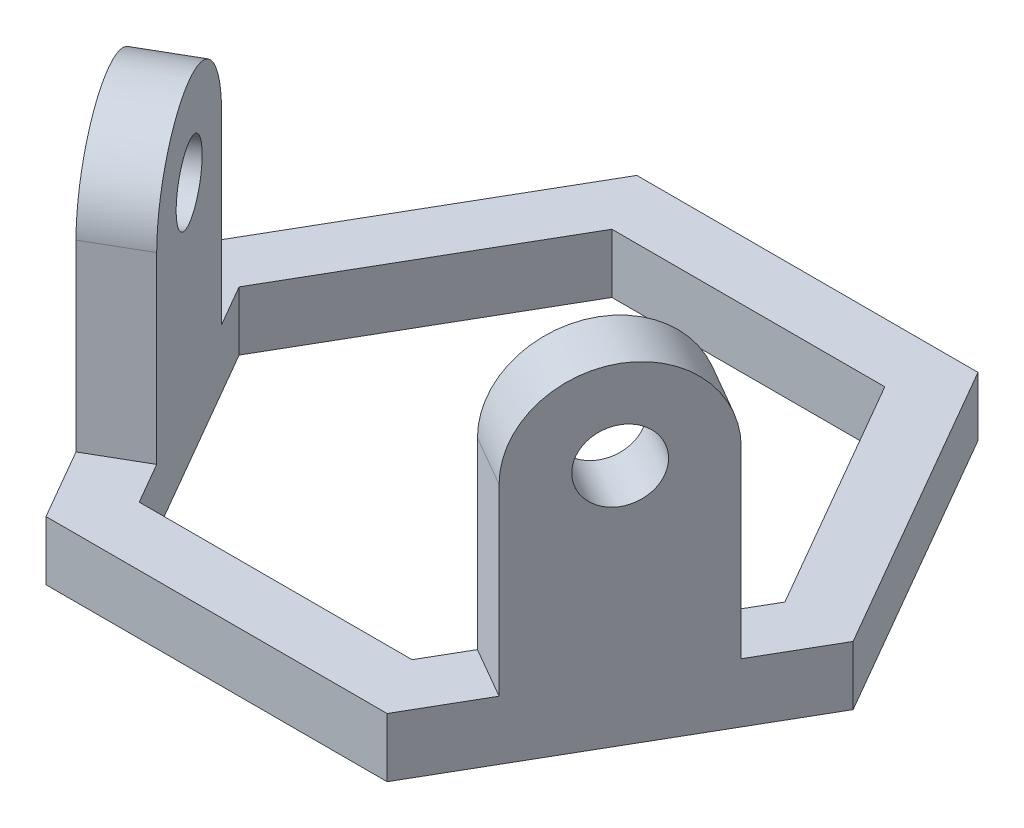
ISO-10303-21;
HEADER;
FILE_DESCRIPTION(('STEP AP214'),'2;1');
FILE_NAME('part.step','',(''),(''),'','','');
FILE_SCHEMA(('AUTOMOTIVE_DESIGN { 1 0 10303 214 1 1 1 1 }'));
ENDSEC;
DATA;
#1=APPLICATION_CONTEXT('core data for automotive mechanical design processes');
#2=APPLICATION_PROTOCOL_DEFINITION('international standard','automotive_design',2000,#1);
#3=PRODUCT_CONTEXT('',#1,'mechanical');
#4=PRODUCT('Part','Part','',(#3));
#5=PRODUCT_RELATED_PRODUCT_CATEGORY('part','',(#4));
#6=PRODUCT_DEFINITION_FORMATION('','',#4);
#7=PRODUCT_DEFINITION_CONTEXT('part definition',#1,'design');
#8=PRODUCT_DEFINITION('design','',#6,#7);
#9=PRODUCT_DEFINITION_SHAPE('','',#8);
#10=(LENGTH_UNIT() NAMED_UNIT(*) SI_UNIT(.MILLI.,.METRE.));
#11=(NAMED_UNIT(*) PLANE_ANGLE_UNIT() SI_UNIT($,.RADIAN.));
#12=(NAMED_UNIT(*) SI_UNIT($,.STERADIAN.) SOLID_ANGLE_UNIT());
#13=UNCERTAINTY_MEASURE_WITH_UNIT(LENGTH_MEASURE(1.E-05),#10,'distance_accuracy_value','');
#14=(GEOMETRIC_REPRESENTATION_CONTEXT(3) GLOBAL_UNCERTAINTY_ASSIGNED_CONTEXT((#13)) GLOBAL_UNIT_ASSIGNED_CONTEXT((#10,
#11,#12)) REPRESENTATION_CONTEXT('',''));
#15=CARTESIAN_POINT('',(0.,0.,0.));
#16=DIRECTION('',(0.,0.,1.));
#17=DIRECTION('',(1.,0.,0.));
#18=AXIS2_PLACEMENT_3D('',#15,#16,#17);
#19=CARTESIAN_POINT('',(0.,10.,0.));
#20=DIRECTION('',(0.,1.,0.));
#21=DIRECTION('',(0.,0.,1.));
#22=AXIS2_PLACEMENT_3D('',#19,#20,#21);
#23=PLANE('',#22);
#24=DIRECTION('',(0.5,0.,-0.866025403784438));
#25=VECTOR('',#24,1.);
#26=CARTESIAN_POINT('',(23.0940107675853,10.,40.0000000000003));
#27=LINE('',#26,#25);
#28=CARTESIAN_POINT('',(42.1410161513778,9.99999999999999,7.00961894323331));
#29=VERTEX_POINT('',#28);
#30=CARTESIAN_POINT('',(46.1880215351703,10.,3.32199545649559E-13));
#31=VERTEX_POINT('',#30);
#32=EDGE_CURVE('E246',#29,#31,#27,.T.);
#33=ORIENTED_EDGE('',*,*,#32,.F.);
#34=DIRECTION('',(0.866025403784442,0.,0.499999999999995));
#35=VECTOR('',#34,1.);
#36=CARTESIAN_POINT('',(42.1410161513778,9.99999999999999,7.00961894323331));
#37=LINE('',#36,#35);
#38=CARTESIAN_POINT('',(50.8012701892222,10.,12.0096189432333));
#39=VERTEX_POINT('',#38);
#40=EDGE_CURVE('E216',#29,#39,#37,.T.);
#41=ORIENTED_EDGE('',*,*,#40,.T.);
#42=DIRECTION('',(0.499999999999995,0.,-0.866025403784441));
#43=VECTOR('',#42,1.);
#44=CARTESIAN_POINT('',(28.8675134594819,10.,49.9999999999997));
#45=LINE('',#44,#43);
#46=CARTESIAN_POINT('',(57.7350269189626,10.,0.));
#47=VERTEX_POINT('',#46);
#48=EDGE_CURVE('E299',#39,#47,#45,.T.);
#49=ORIENTED_EDGE('',*,*,#48,.T.);
#50=DIRECTION('',(-0.500000000000001,0.,-0.866025403784438));
#51=VECTOR('',#50,1.);
#52=CARTESIAN_POINT('',(57.7350269189626,10.,0.));
#53=LINE('',#52,#51);
#54=CARTESIAN_POINT('',(28.8675134594812,10.,-50.0000000000001));
#55=VERTEX_POINT('',#54);
#56=EDGE_CURVE('E300',#47,#55,#53,.T.);
#57=ORIENTED_EDGE('',*,*,#56,.T.);
#58=DIRECTION('',(-1.,0.,0.));
#59=VECTOR('',#58,1.);
#60=CARTESIAN_POINT('',(28.8675134594812,10.,-50.0000000000001));
#61=LINE('',#60,#59);
#62=CARTESIAN_POINT('',(-28.8675134594815,10.,-49.9999999999999));
#63=VERTEX_POINT('',#62);
#64=EDGE_CURVE('E298',#55,#63,#61,.T.);
#65=ORIENTED_EDGE('',*,*,#64,.T.);
#66=DIRECTION('',(-0.499999999999995,0.,0.866025403784442));
#67=VECTOR('',#66,1.);
#68=CARTESIAN_POINT('',(-28.8675134594815,10.,-49.9999999999999));
#69=LINE('',#68,#67);
#70=CARTESIAN_POINT('',(-57.7350269189626,10.,4.03161538170328E-13));
#71=VERTEX_POINT('',#70);
#72=EDGE_CURVE('E305',#63,#71,#69,.T.);
#73=ORIENTED_EDGE('',*,*,#72,.T.);
#74=DIRECTION('',(0.500000000000007,0.,0.866025403784435));
#75=VECTOR('',#74,1.);
#76=CARTESIAN_POINT('',(-57.7350269189626,10.,4.03161538170328E-13));
#77=LINE('',#76,#75);
#78=CARTESIAN_POINT('',(-50.8012701892219,10.,12.0096189432338));
#79=VERTEX_POINT('',#78);
#80=EDGE_CURVE('E301',#71,#79,#77,.T.);
#81=ORIENTED_EDGE('',*,*,#80,.T.);
#82=DIRECTION('',(-0.866025403784435,0.,0.500000000000007));
#83=VECTOR('',#82,1.);
#84=CARTESIAN_POINT('',(-42.1410161513775,10.,7.00961894323377));
#85=LINE('',#84,#83);
#86=CARTESIAN_POINT('',(-42.1410161513775,10.,7.00961894323377));
#87=VERTEX_POINT('',#86);
#88=EDGE_CURVE('E243',#87,#79,#85,.T.);
#89=ORIENTED_EDGE('',*,*,#88,.F.);
#90=DIRECTION('',(0.5,0.,0.866025403784439));
#91=VECTOR('',#90,1.);
#92=CARTESIAN_POINT('',(-46.1880215351703,10.,0.));
#93=LINE('',#92,#91);
#94=CARTESIAN_POINT('',(-46.1880215351703,10.,0.));
#95=VERTEX_POINT('',#94);
#96=EDGE_CURVE('E260',#95,#87,#93,.T.);
#97=ORIENTED_EDGE('',*,*,#96,.F.);
#98=DIRECTION('',(-0.5,0.,0.866025403784439));
#99=VECTOR('',#98,1.);
#100=CARTESIAN_POINT('',(-23.0940107675852,10.,-40.0000000000001));
#101=LINE('',#100,#99);
#102=CARTESIAN_POINT('',(-23.0940107675852,10.,-40.0000000000001));
#103=VERTEX_POINT('',#102);
#104=EDGE_CURVE('E255',#103,#95,#101,.T.);
#105=ORIENTED_EDGE('',*,*,#104,.F.);
#106=DIRECTION('',(-1.,0.,0.));
#107=VECTOR('',#106,1.);
#108=CARTESIAN_POINT('',(23.094010767585,10.,-40.0000000000001));
#109=LINE('',#108,#107);
#110=CARTESIAN_POINT('',(23.094010767585,10.,-40.0000000000001));
#111=VERTEX_POINT('',#110);
#112=EDGE_CURVE('E252',#111,#103,#109,.T.);
#113=ORIENTED_EDGE('',*,*,#112,.F.);
#114=DIRECTION('',(-0.5,0.,-0.866025403784439));
#115=VECTOR('',#114,1.);
#116=CARTESIAN_POINT('',(46.1880215351703,10.,3.32199545649559E-13));
#117=LINE('',#116,#115);
#118=EDGE_CURVE('E249',#31,#111,#117,.T.);
#119=ORIENTED_EDGE('',*,*,#118,.F.);
#120=EDGE_LOOP('',(#33,#41,#49,#57,#65,#73,#81,#89,#97,#105,#113,#119));
#121=FACE_BOUND('',#120,.T.);
#122=ADVANCED_FACE('F39',(#121),#23,.T.);
#123=DIRECTION('',(0.866025403784442,0.,0.499999999999995));
#124=VECTOR('',#123,1.);
#125=CARTESIAN_POINT('',(27.1410161513779,9.99999999999999,32.9903810567665));
#126=LINE('',#125,#124);
#127=CARTESIAN_POINT('',(27.1410161513779,9.99999999999999,32.9903810567665));
#128=VERTEX_POINT('',#127);
#129=CARTESIAN_POINT('',(35.8012701892223,9.99999999999999,37.9903810567665));
#130=VERTEX_POINT('',#129);
#131=EDGE_CURVE('E187',#128,#130,#126,.T.);
#132=ORIENTED_EDGE('',*,*,#131,.F.);
#133=CARTESIAN_POINT('',(23.0940107675853,10.,40.0000000000003));
#134=VERTEX_POINT('',#133);
#135=EDGE_CURVE('E200',#134,#128,#27,.T.);
#136=ORIENTED_EDGE('',*,*,#135,.F.);
#137=DIRECTION('',(1.,0.,0.));
#138=VECTOR('',#137,1.);
#139=CARTESIAN_POINT('',(-23.0940107675851,10.,40.0000000000003));
#140=LINE('',#139,#138);
#141=CARTESIAN_POINT('',(-23.0940107675851,10.,40.0000000000003));
#142=VERTEX_POINT('',#141);
#143=EDGE_CURVE('E257',#142,#134,#140,.T.);
#144=ORIENTED_EDGE('',*,*,#143,.F.);
#145=CARTESIAN_POINT('',(-27.1410161513773,10.,32.9903810567668));
#146=VERTEX_POINT('',#145);
#147=EDGE_CURVE('E258',#146,#142,#93,.T.);
#148=ORIENTED_EDGE('',*,*,#147,.F.);
#149=DIRECTION('',(-0.866025403784435,0.,0.500000000000007));
#150=VECTOR('',#149,1.);
#151=CARTESIAN_POINT('',(-27.1410161513773,10.,32.9903810567668));
#152=LINE('',#151,#150);
#153=CARTESIAN_POINT('',(-35.8012701892216,10.,37.9903810567669));
#154=VERTEX_POINT('',#153);
#155=EDGE_CURVE('E244',#146,#154,#152,.T.);
#156=ORIENTED_EDGE('',*,*,#155,.T.);
#157=CARTESIAN_POINT('',(-28.8675134594808,10.,50.0000000000003));
#158=VERTEX_POINT('',#157);
#159=EDGE_CURVE('E304',#154,#158,#77,.T.);
#160=ORIENTED_EDGE('',*,*,#159,.T.);
#161=DIRECTION('',(1.,0.,0.));
#162=VECTOR('',#161,1.);
#163=CARTESIAN_POINT('',(-28.8675134594808,10.,50.0000000000003));
#164=LINE('',#163,#162);
#165=CARTESIAN_POINT('',(28.8675134594819,10.,49.9999999999997));
#166=VERTEX_POINT('',#165);
#167=EDGE_CURVE('E306',#158,#166,#164,.T.);
#168=ORIENTED_EDGE('',*,*,#167,.T.);
#169=EDGE_CURVE('E294',#166,#130,#45,.T.);
#170=ORIENTED_EDGE('',*,*,#169,.T.);
#171=EDGE_LOOP('',(#132,#136,#144,#148,#156,#160,#168,#170));
#172=FACE_BOUND('',#171,.T.);
#173=ADVANCED_FACE('F374',(#172),#23,.T.);
#174=CARTESIAN_POINT('',(0.,0.,0.));
#175=DIRECTION('',(0.,1.,0.));
#176=DIRECTION('',(0.,0.,1.));
#177=AXIS2_PLACEMENT_3D('',#174,#175,#176);
#178=PLANE('',#177);
#179=DIRECTION('',(0.499999999999995,0.,-0.866025403784441));
#180=VECTOR('',#179,1.);
#181=CARTESIAN_POINT('',(28.8675134594819,0.,49.9999999999997));
#182=LINE('',#181,#180);
#183=CARTESIAN_POINT('',(28.8675134594819,0.,49.9999999999997));
#184=VERTEX_POINT('',#183);
#185=CARTESIAN_POINT('',(57.7350269189626,0.,0.));
#186=VERTEX_POINT('',#185);
#187=EDGE_CURVE('E291',#184,#186,#182,.T.);
#188=ORIENTED_EDGE('',*,*,#187,.F.);
#189=DIRECTION('',(1.,0.,0.));
#190=VECTOR('',#189,1.);
#191=CARTESIAN_POINT('',(-28.8675134594808,0.,50.0000000000003));
#192=LINE('',#191,#190);
#193=CARTESIAN_POINT('',(-28.8675134594808,0.,50.0000000000003));
#194=VERTEX_POINT('',#193);
#195=EDGE_CURVE('E321',#194,#184,#192,.T.);
#196=ORIENTED_EDGE('',*,*,#195,.F.);
#197=DIRECTION('',(0.500000000000007,0.,0.866025403784435));
#198=VECTOR('',#197,1.);
#199=CARTESIAN_POINT('',(-57.7350269189626,0.,4.03161538170328E-13));
#200=LINE('',#199,#198);
#201=CARTESIAN_POINT('',(-57.7350269189626,0.,4.03161538170328E-13));
#202=VERTEX_POINT('',#201);
#203=EDGE_CURVE('E317',#202,#194,#200,.T.);
#204=ORIENTED_EDGE('',*,*,#203,.F.);
#205=DIRECTION('',(-0.499999999999995,0.,0.866025403784442));
#206=VECTOR('',#205,1.);
#207=CARTESIAN_POINT('',(-28.8675134594815,0.,-49.9999999999999));
#208=LINE('',#207,#206);
#209=CARTESIAN_POINT('',(-28.8675134594815,0.,-49.9999999999999));
#210=VERTEX_POINT('',#209);
#211=EDGE_CURVE('E320',#210,#202,#208,.T.);
#212=ORIENTED_EDGE('',*,*,#211,.F.);
#213=DIRECTION('',(-1.,0.,0.));
#214=VECTOR('',#213,1.);
#215=CARTESIAN_POINT('',(28.8675134594812,0.,-50.0000000000001));
#216=LINE('',#215,#214);
#217=CARTESIAN_POINT('',(28.8675134594812,0.,-50.0000000000001));
#218=VERTEX_POINT('',#217);
#219=EDGE_CURVE('E312',#218,#210,#216,.T.);
#220=ORIENTED_EDGE('',*,*,#219,.F.);
#221=DIRECTION('',(-0.500000000000001,0.,-0.866025403784438));
#222=VECTOR('',#221,1.);
#223=CARTESIAN_POINT('',(57.7350269189626,0.,0.));
#224=LINE('',#223,#222);
#225=EDGE_CURVE('E311',#186,#218,#224,.T.);
#226=ORIENTED_EDGE('',*,*,#225,.F.);
#227=EDGE_LOOP('',(#188,#196,#204,#212,#220,#226));
#228=FACE_BOUND('',#227,.T.);
#229=DIRECTION('',(0.5,0.,-0.866025403784438));
#230=VECTOR('',#229,1.);
#231=CARTESIAN_POINT('',(23.0940107675853,0.,40.0000000000003));
#232=LINE('',#231,#230);
#233=CARTESIAN_POINT('',(23.0940107675853,0.,40.0000000000003));
#234=VERTEX_POINT('',#233);
#235=CARTESIAN_POINT('',(46.1880215351703,0.,3.32199545649559E-13));
#236=VERTEX_POINT('',#235);
#237=EDGE_CURVE('E245',#234,#236,#232,.T.);
#238=ORIENTED_EDGE('',*,*,#237,.T.);
#239=DIRECTION('',(-0.5,0.,-0.866025403784439));
#240=VECTOR('',#239,1.);
#241=CARTESIAN_POINT('',(46.1880215351703,0.,3.32199545649559E-13));
#242=LINE('',#241,#240);
#243=CARTESIAN_POINT('',(23.094010767585,0.,-40.0000000000001));
#244=VERTEX_POINT('',#243);
#245=EDGE_CURVE('E264',#236,#244,#242,.T.);
#246=ORIENTED_EDGE('',*,*,#245,.T.);
#247=DIRECTION('',(-1.,0.,0.));
#248=VECTOR('',#247,1.);
#249=CARTESIAN_POINT('',(23.094010767585,0.,-40.0000000000001));
#250=LINE('',#249,#248);
#251=CARTESIAN_POINT('',(-23.0940107675852,0.,-40.0000000000001));
#252=VERTEX_POINT('',#251);
#253=EDGE_CURVE('E268',#244,#252,#250,.T.);
#254=ORIENTED_EDGE('',*,*,#253,.T.);
#255=DIRECTION('',(-0.5,0.,0.866025403784439));
#256=VECTOR('',#255,1.);
#257=CARTESIAN_POINT('',(-23.0940107675852,0.,-40.0000000000001));
#258=LINE('',#257,#256);
#259=CARTESIAN_POINT('',(-46.1880215351703,0.,0.));
#260=VERTEX_POINT('',#259);
#261=EDGE_CURVE('E271',#252,#260,#258,.T.);
#262=ORIENTED_EDGE('',*,*,#261,.T.);
#263=DIRECTION('',(0.5,0.,0.866025403784439));
#264=VECTOR('',#263,1.);
#265=CARTESIAN_POINT('',(-46.1880215351703,0.,0.));
#266=LINE('',#265,#264);
#267=CARTESIAN_POINT('',(-23.0940107675851,0.,40.0000000000003));
#268=VERTEX_POINT('',#267);
#269=EDGE_CURVE('E273',#260,#268,#266,.T.);
#270=ORIENTED_EDGE('',*,*,#269,.T.);
#271=DIRECTION('',(1.,0.,0.));
#272=VECTOR('',#271,1.);
#273=CARTESIAN_POINT('',(-23.0940107675851,0.,40.0000000000003));
#274=LINE('',#273,#272);
#275=EDGE_CURVE('E280',#268,#234,#274,.T.);
#276=ORIENTED_EDGE('',*,*,#275,.T.);
#277=EDGE_LOOP('',(#238,#246,#254,#262,#270,#276));
#278=FACE_BOUND('',#277,.T.);
#279=ADVANCED_FACE('F341',(#228,#278),#178,.F.);
#280=CARTESIAN_POINT('',(28.8675134594819,10.,49.9999999999997));
#281=DIRECTION('',(-0.866025403784441,0.,-0.499999999999995));
#282=DIRECTION('',(-0.499999999999995,0.,0.866025403784441));
#283=AXIS2_PLACEMENT_3D('',#280,#281,#282);
#284=PLANE('',#283);
#285=ORIENTED_EDGE('',*,*,#187,.T.);
#286=DIRECTION('',(0.,-1.,0.));
#287=VECTOR('',#286,1.);
#288=CARTESIAN_POINT('',(57.7350269189626,10.,0.));
#289=LINE('',#288,#287);
#290=EDGE_CURVE('E11',#47,#186,#289,.T.);
#291=ORIENTED_EDGE('',*,*,#290,.F.);
#292=ORIENTED_EDGE('',*,*,#48,.F.);
#293=DIRECTION('',(0.,1.,0.));
#294=VECTOR('',#293,1.);
#295=CARTESIAN_POINT('',(50.8012701892222,41.0478262350558,12.0096189432332));
#296=LINE('',#295,#294);
#297=CARTESIAN_POINT('',(50.8012701892222,41.0478262350558,12.0096189432332));
#298=VERTEX_POINT('',#297);
#299=EDGE_CURVE('E53',#39,#298,#296,.T.);
#300=ORIENTED_EDGE('',*,*,#299,.T.);
#301=CARTESIAN_POINT('',(43.3012701892223,41.0478262350558,24.9999999999999));
#302=DIRECTION('',(0.866025403784442,0.,0.499999999999995));
#303=DIRECTION('',(0.499999999999995,0.,-0.866025403784442));
#304=AXIS2_PLACEMENT_3D('',#301,#302,#303);
#305=CIRCLE('',#304,15.);
#306=CARTESIAN_POINT('',(35.8012701892223,41.0478262350558,37.9903810567665));
#307=VERTEX_POINT('',#306);
#308=EDGE_CURVE('E209',#298,#307,#305,.T.);
#309=ORIENTED_EDGE('',*,*,#308,.T.);
#310=DIRECTION('',(0.,-1.,0.));
#311=VECTOR('',#310,1.);
#312=CARTESIAN_POINT('',(35.8012701892223,9.99999999999999,37.9903810567665));
#313=LINE('',#312,#311);
#314=EDGE_CURVE('E182',#307,#130,#313,.T.);
#315=ORIENTED_EDGE('',*,*,#314,.T.);
#316=ORIENTED_EDGE('',*,*,#169,.F.);
#317=DIRECTION('',(0.,-1.,0.));
#318=VECTOR('',#317,1.);
#319=CARTESIAN_POINT('',(28.8675134594819,10.,49.9999999999997));
#320=LINE('',#319,#318);
#321=EDGE_CURVE('E309',#166,#184,#320,.T.);
#322=ORIENTED_EDGE('',*,*,#321,.T.);
#323=EDGE_LOOP('',(#285,#291,#292,#300,#309,#315,#316,#322));
#324=FACE_BOUND('',#323,.T.);
#325=CARTESIAN_POINT('',(43.3012701892223,41.0478262350558,24.9999999999999));
#326=DIRECTION('',(0.866025403784442,0.,0.499999999999995));
#327=DIRECTION('',(0.499999999999995,0.,-0.866025403784442));
#328=AXIS2_PLACEMENT_3D('',#325,#326,#327);
#329=CIRCLE('',#328,6.);
#330=CARTESIAN_POINT('',(46.3012701892222,41.0478262350558,19.8038475772932));
#331=VERTEX_POINT('',#330);
#332=EDGE_CURVE('E206',#331,#331,#329,.T.);
#333=ORIENTED_EDGE('',*,*,#332,.F.);
#334=EDGE_LOOP('',(#333));
#335=FACE_BOUND('',#334,.T.);
#336=ADVANCED_FACE('F41',(#324,#335),#284,.F.);
#337=CARTESIAN_POINT('',(57.7350269189626,10.,0.));
#338=DIRECTION('',(-0.866025403784438,0.,0.500000000000001));
#339=DIRECTION('',(0.500000000000001,0.,0.866025403784438));
#340=AXIS2_PLACEMENT_3D('',#337,#338,#339);
#341=PLANE('',#340);
#342=ORIENTED_EDGE('',*,*,#225,.T.);
#343=DIRECTION('',(0.,-1.,0.));
#344=VECTOR('',#343,1.);
#345=CARTESIAN_POINT('',(28.8675134594812,10.,-50.0000000000001));
#346=LINE('',#345,#344);
#347=EDGE_CURVE('E50',#55,#218,#346,.T.);
#348=ORIENTED_EDGE('',*,*,#347,.F.);
#349=ORIENTED_EDGE('',*,*,#56,.F.);
#350=ORIENTED_EDGE('',*,*,#290,.T.);
#351=EDGE_LOOP('',(#342,#348,#349,#350));
#352=FACE_BOUND('',#351,.T.);
#353=ADVANCED_FACE('F364',(#352),#341,.F.);
#354=CARTESIAN_POINT('',(28.8675134594812,10.,-50.0000000000001));
#355=DIRECTION('',(0.,0.,1.));
#356=DIRECTION('',(1.,0.,0.));
#357=AXIS2_PLACEMENT_3D('',#354,#355,#356);
#358=PLANE('',#357);
#359=ORIENTED_EDGE('',*,*,#219,.T.);
#360=DIRECTION('',(0.,-1.,0.));
#361=VECTOR('',#360,1.);
#362=CARTESIAN_POINT('',(-28.8675134594815,10.,-49.9999999999999));
#363=LINE('',#362,#361);
#364=EDGE_CURVE('E332',#63,#210,#363,.T.);
#365=ORIENTED_EDGE('',*,*,#364,.F.);
#366=ORIENTED_EDGE('',*,*,#64,.F.);
#367=ORIENTED_EDGE('',*,*,#347,.T.);
#368=EDGE_LOOP('',(#359,#365,#366,#367));
#369=FACE_BOUND('',#368,.T.);
#370=ADVANCED_FACE('F339',(#369),#358,.F.);
#371=CARTESIAN_POINT('',(-28.8675134594815,10.,-49.9999999999999));
#372=DIRECTION('',(0.866025403784442,0.,0.499999999999995));
#373=DIRECTION('',(0.499999999999995,0.,-0.866025403784442));
#374=AXIS2_PLACEMENT_3D('',#371,#372,#373);
#375=PLANE('',#374);
#376=ORIENTED_EDGE('',*,*,#211,.T.);
#377=DIRECTION('',(0.,-1.,0.));
#378=VECTOR('',#377,1.);
#379=CARTESIAN_POINT('',(-57.7350269189626,10.,4.03161538170328E-13));
#380=LINE('',#379,#378);
#381=EDGE_CURVE('E327',#71,#202,#380,.T.);
#382=ORIENTED_EDGE('',*,*,#381,.F.);
#383=ORIENTED_EDGE('',*,*,#72,.F.);
#384=ORIENTED_EDGE('',*,*,#364,.T.);
#385=EDGE_LOOP('',(#376,#382,#383,#384));
#386=FACE_BOUND('',#385,.T.);
#387=ADVANCED_FACE('F352',(#386),#375,.F.);
#388=CARTESIAN_POINT('',(-57.7350269189626,10.,4.03161538170328E-13));
#389=DIRECTION('',(0.866025403784435,0.,-0.500000000000007));
#390=DIRECTION('',(-0.500000000000007,0.,-0.866025403784435));
#391=AXIS2_PLACEMENT_3D('',#388,#389,#390);
#392=PLANE('',#391);
#393=ORIENTED_EDGE('',*,*,#203,.T.);
#394=DIRECTION('',(0.,-1.,0.));
#395=VECTOR('',#394,1.);
#396=CARTESIAN_POINT('',(-28.8675134594808,10.,50.0000000000003));
#397=LINE('',#396,#395);
#398=EDGE_CURVE('E324',#158,#194,#397,.T.);
#399=ORIENTED_EDGE('',*,*,#398,.F.);
#400=ORIENTED_EDGE('',*,*,#159,.F.);
#401=DIRECTION('',(0.,1.,0.));
#402=VECTOR('',#401,1.);
#403=CARTESIAN_POINT('',(-35.8012701892216,41.0478262350558,37.9903810567669));
#404=LINE('',#403,#402);
#405=CARTESIAN_POINT('',(-35.8012701892216,41.0478262350558,37.9903810567669));
#406=VERTEX_POINT('',#405);
#407=EDGE_CURVE('E65',#154,#406,#404,.T.);
#408=ORIENTED_EDGE('',*,*,#407,.T.);
#409=CARTESIAN_POINT('',(-43.3012701892218,41.0478262350558,25.0000000000004));
#410=DIRECTION('',(-0.866025403784434,0.,0.500000000000007));
#411=DIRECTION('',(0.500000000000007,0.,0.866025403784435));
#412=AXIS2_PLACEMENT_3D('',#409,#410,#411);
#413=CIRCLE('',#412,15.);
#414=CARTESIAN_POINT('',(-50.8012701892219,41.0478262350558,12.0096189432338));
#415=VERTEX_POINT('',#414);
#416=EDGE_CURVE('E225',#406,#415,#413,.T.);
#417=ORIENTED_EDGE('',*,*,#416,.T.);
#418=DIRECTION('',(0.,-1.,0.));
#419=VECTOR('',#418,1.);
#420=CARTESIAN_POINT('',(-50.8012701892219,10.,12.0096189432338));
#421=LINE('',#420,#419);
#422=EDGE_CURVE('E237',#415,#79,#421,.T.);
#423=ORIENTED_EDGE('',*,*,#422,.T.);
#424=ORIENTED_EDGE('',*,*,#80,.F.);
#425=ORIENTED_EDGE('',*,*,#381,.T.);
#426=EDGE_LOOP('',(#393,#399,#400,#408,#417,#423,#424,#425));
#427=FACE_BOUND('',#426,.T.);
#428=CARTESIAN_POINT('',(-43.3012701892218,41.0478262350558,25.0000000000004));
#429=DIRECTION('',(-0.866025403784434,0.,0.500000000000007));
#430=DIRECTION('',(0.500000000000007,0.,0.866025403784435));
#431=AXIS2_PLACEMENT_3D('',#428,#429,#430);
#432=CIRCLE('',#431,6.);
#433=CARTESIAN_POINT('',(-40.3012701892217,41.0478262350558,30.196152422707));
#434=VERTEX_POINT('',#433);
#435=EDGE_CURVE('E214',#434,#434,#432,.T.);
#436=ORIENTED_EDGE('',*,*,#435,.F.);
#437=EDGE_LOOP('',(#436));
#438=FACE_BOUND('',#437,.T.);
#439=ADVANCED_FACE('F353',(#427,#438),#392,.F.);
#440=CARTESIAN_POINT('',(-28.8675134594808,10.,50.0000000000003));
#441=DIRECTION('',(0.,0.,-1.));
#442=DIRECTION('',(-1.,0.,0.));
#443=AXIS2_PLACEMENT_3D('',#440,#441,#442);
#444=PLANE('',#443);
#445=ORIENTED_EDGE('',*,*,#195,.T.);
#446=ORIENTED_EDGE('',*,*,#321,.F.);
#447=ORIENTED_EDGE('',*,*,#167,.F.);
#448=ORIENTED_EDGE('',*,*,#398,.T.);
#449=EDGE_LOOP('',(#445,#446,#447,#448));
#450=FACE_BOUND('',#449,.T.);
#451=ADVANCED_FACE('F371',(#450),#444,.F.);
#452=CARTESIAN_POINT('',(23.0940107675853,10.,40.0000000000003));
#453=DIRECTION('',(-0.866025403784439,0.,-0.5));
#454=DIRECTION('',(-0.5,0.,0.866025403784439));
#455=AXIS2_PLACEMENT_3D('',#452,#453,#454);
#456=PLANE('',#455);
#457=ORIENTED_EDGE('',*,*,#237,.F.);
#458=DIRECTION('',(0.,-1.,0.));
#459=VECTOR('',#458,1.);
#460=CARTESIAN_POINT('',(23.0940107675853,10.,40.0000000000003));
#461=LINE('',#460,#459);
#462=EDGE_CURVE('E265',#134,#234,#461,.T.);
#463=ORIENTED_EDGE('',*,*,#462,.F.);
#464=ORIENTED_EDGE('',*,*,#135,.T.);
#465=DIRECTION('',(0.,-1.,0.));
#466=VECTOR('',#465,1.);
#467=CARTESIAN_POINT('',(27.1410161513779,9.99999999999999,32.9903810567665));
#468=LINE('',#467,#466);
#469=CARTESIAN_POINT('',(27.1410161513779,41.0478262350558,32.9903810567665));
#470=VERTEX_POINT('',#469);
#471=EDGE_CURVE('E178',#470,#128,#468,.T.);
#472=ORIENTED_EDGE('',*,*,#471,.F.);
#473=CARTESIAN_POINT('',(34.6410161513779,41.0478262350558,19.9999999999999));
#474=DIRECTION('',(0.866025403784442,0.,0.499999999999995));
#475=DIRECTION('',(0.499999999999995,0.,-0.866025403784442));
#476=AXIS2_PLACEMENT_3D('',#473,#474,#475);
#477=CIRCLE('',#476,15.);
#478=CARTESIAN_POINT('',(42.1410161513778,41.0478262350558,7.0096189432333));
#479=VERTEX_POINT('',#478);
#480=EDGE_CURVE('E191',#479,#470,#477,.T.);
#481=ORIENTED_EDGE('',*,*,#480,.F.);
#482=DIRECTION('',(0.,1.,0.));
#483=VECTOR('',#482,1.);
#484=CARTESIAN_POINT('',(42.1410161513778,41.0478262350558,7.0096189432333));
#485=LINE('',#484,#483);
#486=EDGE_CURVE('E190',#29,#479,#485,.T.);
#487=ORIENTED_EDGE('',*,*,#486,.F.);
#488=ORIENTED_EDGE('',*,*,#32,.T.);
#489=DIRECTION('',(0.,-1.,0.));
#490=VECTOR('',#489,1.);
#491=CARTESIAN_POINT('',(46.1880215351703,10.,3.32199545649559E-13));
#492=LINE('',#491,#490);
#493=EDGE_CURVE('E286',#31,#236,#492,.T.);
#494=ORIENTED_EDGE('',*,*,#493,.T.);
#495=EDGE_LOOP('',(#457,#463,#464,#472,#481,#487,#488,#494));
#496=FACE_BOUND('',#495,.T.);
#497=CARTESIAN_POINT('',(34.6410161513779,41.0478262350558,19.9999999999999));
#498=DIRECTION('',(0.866025403784442,0.,0.499999999999995));
#499=DIRECTION('',(0.499999999999995,0.,-0.866025403784442));
#500=AXIS2_PLACEMENT_3D('',#497,#498,#499);
#501=CIRCLE('',#500,6.);
#502=CARTESIAN_POINT('',(37.6410161513778,41.0478262350558,14.8038475772933));
#503=VERTEX_POINT('',#502);
#504=EDGE_CURVE('E215',#503,#503,#501,.T.);
#505=ORIENTED_EDGE('',*,*,#504,.T.);
#506=EDGE_LOOP('',(#505));
#507=FACE_BOUND('',#506,.T.);
#508=ADVANCED_FACE('F195',(#496,#507),#456,.T.);
#509=CARTESIAN_POINT('',(46.1880215351703,10.,3.32199545649559E-13));
#510=DIRECTION('',(-0.866025403784439,0.,0.5));
#511=DIRECTION('',(0.5,0.,0.866025403784439));
#512=AXIS2_PLACEMENT_3D('',#509,#510,#511);
#513=PLANE('',#512);
#514=ORIENTED_EDGE('',*,*,#245,.F.);
#515=ORIENTED_EDGE('',*,*,#493,.F.);
#516=ORIENTED_EDGE('',*,*,#118,.T.);
#517=DIRECTION('',(0.,-1.,0.));
#518=VECTOR('',#517,1.);
#519=CARTESIAN_POINT('',(23.094010767585,10.,-40.0000000000001));
#520=LINE('',#519,#518);
#521=EDGE_CURVE('E288',#111,#244,#520,.T.);
#522=ORIENTED_EDGE('',*,*,#521,.T.);
#523=EDGE_LOOP('',(#514,#515,#516,#522));
#524=FACE_BOUND('',#523,.T.);
#525=ADVANCED_FACE('F436',(#524),#513,.T.);
#526=CARTESIAN_POINT('',(23.094010767585,10.,-40.0000000000001));
#527=DIRECTION('',(0.,0.,1.));
#528=DIRECTION('',(1.,0.,0.));
#529=AXIS2_PLACEMENT_3D('',#526,#527,#528);
#530=PLANE('',#529);
#531=ORIENTED_EDGE('',*,*,#253,.F.);
#532=ORIENTED_EDGE('',*,*,#521,.F.);
#533=ORIENTED_EDGE('',*,*,#112,.T.);
#534=DIRECTION('',(0.,-1.,0.));
#535=VECTOR('',#534,1.);
#536=CARTESIAN_POINT('',(-23.0940107675852,10.,-40.0000000000001));
#537=LINE('',#536,#535);
#538=EDGE_CURVE('E287',#103,#252,#537,.T.);
#539=ORIENTED_EDGE('',*,*,#538,.T.);
#540=EDGE_LOOP('',(#531,#532,#533,#539));
#541=FACE_BOUND('',#540,.T.);
#542=ADVANCED_FACE('F522',(#541),#530,.T.);
#543=CARTESIAN_POINT('',(-23.0940107675852,10.,-40.0000000000001));
#544=DIRECTION('',(0.866025403784439,0.,0.5));
#545=DIRECTION('',(0.5,0.,-0.866025403784439));
#546=AXIS2_PLACEMENT_3D('',#543,#544,#545);
#547=PLANE('',#546);
#548=ORIENTED_EDGE('',*,*,#261,.F.);
#549=ORIENTED_EDGE('',*,*,#538,.F.);
#550=ORIENTED_EDGE('',*,*,#104,.T.);
#551=DIRECTION('',(0.,-1.,0.));
#552=VECTOR('',#551,1.);
#553=CARTESIAN_POINT('',(-46.1880215351703,10.,0.));
#554=LINE('',#553,#552);
#555=EDGE_CURVE('E281',#95,#260,#554,.T.);
#556=ORIENTED_EDGE('',*,*,#555,.T.);
#557=EDGE_LOOP('',(#548,#549,#550,#556));
#558=FACE_BOUND('',#557,.T.);
#559=ADVANCED_FACE('F511',(#558),#547,.T.);
#560=CARTESIAN_POINT('',(-46.1880215351703,10.,0.));
#561=DIRECTION('',(0.866025403784439,0.,-0.5));
#562=DIRECTION('',(-0.5,0.,-0.866025403784439));
#563=AXIS2_PLACEMENT_3D('',#560,#561,#562);
#564=PLANE('',#563);
#565=ORIENTED_EDGE('',*,*,#269,.F.);
#566=ORIENTED_EDGE('',*,*,#555,.F.);
#567=ORIENTED_EDGE('',*,*,#96,.T.);
#568=DIRECTION('',(0.,-1.,0.));
#569=VECTOR('',#568,1.);
#570=CARTESIAN_POINT('',(-42.1410161513775,10.,7.00961894323377));
#571=LINE('',#570,#569);
#572=CARTESIAN_POINT('',(-42.1410161513775,41.0478262350558,7.00961894323377));
#573=VERTEX_POINT('',#572);
#574=EDGE_CURVE('E229',#573,#87,#571,.T.);
#575=ORIENTED_EDGE('',*,*,#574,.F.);
#576=CARTESIAN_POINT('',(-34.6410161513774,41.0478262350558,20.0000000000003));
#577=DIRECTION('',(-0.866025403784434,0.,0.500000000000007));
#578=DIRECTION('',(0.500000000000007,0.,0.866025403784435));
#579=AXIS2_PLACEMENT_3D('',#576,#577,#578);
#580=CIRCLE('',#579,15.);
#581=CARTESIAN_POINT('',(-27.1410161513773,41.0478262350558,32.9903810567668));
#582=VERTEX_POINT('',#581);
#583=EDGE_CURVE('E223',#582,#573,#580,.T.);
#584=ORIENTED_EDGE('',*,*,#583,.F.);
#585=DIRECTION('',(0.,1.,0.));
#586=VECTOR('',#585,1.);
#587=CARTESIAN_POINT('',(-27.1410161513773,41.0478262350558,32.9903810567668));
#588=LINE('',#587,#586);
#589=EDGE_CURVE('E228',#146,#582,#588,.T.);
#590=ORIENTED_EDGE('',*,*,#589,.F.);
#591=ORIENTED_EDGE('',*,*,#147,.T.);
#592=DIRECTION('',(0.,-1.,0.));
#593=VECTOR('',#592,1.);
#594=CARTESIAN_POINT('',(-23.0940107675851,10.,40.0000000000003));
#595=LINE('',#594,#593);
#596=EDGE_CURVE('E285',#142,#268,#595,.T.);
#597=ORIENTED_EDGE('',*,*,#596,.T.);
#598=EDGE_LOOP('',(#565,#566,#567,#575,#584,#590,#591,#597));
#599=FACE_BOUND('',#598,.T.);
#600=CARTESIAN_POINT('',(-34.6410161513774,41.0478262350558,20.0000000000003));
#601=DIRECTION('',(-0.866025403784434,0.,0.500000000000007));
#602=DIRECTION('',(0.500000000000007,0.,0.866025403784435));
#603=AXIS2_PLACEMENT_3D('',#600,#601,#602);
#604=CIRCLE('',#603,6.);
#605=CARTESIAN_POINT('',(-31.6410161513774,41.0478262350558,25.1961524227069));
#606=VERTEX_POINT('',#605);
#607=EDGE_CURVE('E218',#606,#606,#604,.T.);
#608=ORIENTED_EDGE('',*,*,#607,.T.);
#609=EDGE_LOOP('',(#608));
#610=FACE_BOUND('',#609,.T.);
#611=ADVANCED_FACE('F382',(#599,#610),#564,.T.);
#612=CARTESIAN_POINT('',(-23.0940107675851,10.,40.0000000000003));
#613=DIRECTION('',(0.,0.,-1.));
#614=DIRECTION('',(-1.,0.,0.));
#615=AXIS2_PLACEMENT_3D('',#612,#613,#614);
#616=PLANE('',#615);
#617=ORIENTED_EDGE('',*,*,#275,.F.);
#618=ORIENTED_EDGE('',*,*,#596,.F.);
#619=ORIENTED_EDGE('',*,*,#143,.T.);
#620=ORIENTED_EDGE('',*,*,#462,.T.);
#621=EDGE_LOOP('',(#617,#618,#619,#620));
#622=FACE_BOUND('',#621,.T.);
#623=ADVANCED_FACE('F497',(#622),#616,.T.);
#624=CARTESIAN_POINT('',(-34.6410161513774,41.0478262350558,20.0000000000003));
#625=DIRECTION('',(-0.866025403784435,0.,0.500000000000007));
#626=DIRECTION('',(0.500000000000007,0.,0.866025403784435));
#627=AXIS2_PLACEMENT_3D('',#624,#625,#626);
#628=CYLINDRICAL_SURFACE('',#627,15.);
#629=ORIENTED_EDGE('',*,*,#416,.F.);
#630=DIRECTION('',(-0.866025403784435,0.,0.500000000000007));
#631=VECTOR('',#630,1.);
#632=CARTESIAN_POINT('',(-27.1410161513773,41.0478262350558,32.9903810567668));
#633=LINE('',#632,#631);
#634=EDGE_CURVE('E238',#582,#406,#633,.T.);
#635=ORIENTED_EDGE('',*,*,#634,.F.);
#636=ORIENTED_EDGE('',*,*,#583,.T.);
#637=DIRECTION('',(-0.866025403784435,0.,0.500000000000007));
#638=VECTOR('',#637,1.);
#639=CARTESIAN_POINT('',(-42.1410161513775,41.0478262350558,7.00961894323377));
#640=LINE('',#639,#638);
#641=EDGE_CURVE('E233',#573,#415,#640,.T.);
#642=ORIENTED_EDGE('',*,*,#641,.T.);
#643=EDGE_LOOP('',(#629,#635,#636,#642));
#644=FACE_BOUND('',#643,.T.);
#645=ADVANCED_FACE('F386',(#644),#628,.T.);
#646=CARTESIAN_POINT('',(-27.1410161513773,41.0478262350558,32.9903810567668));
#647=DIRECTION('',(0.500000000000007,0.,0.866025403784435));
#648=DIRECTION('',(0.866025403784435,0.,-0.500000000000007));
#649=AXIS2_PLACEMENT_3D('',#646,#647,#648);
#650=PLANE('',#649);
#651=ORIENTED_EDGE('',*,*,#407,.F.);
#652=ORIENTED_EDGE('',*,*,#155,.F.);
#653=ORIENTED_EDGE('',*,*,#589,.T.);
#654=ORIENTED_EDGE('',*,*,#634,.T.);
#655=EDGE_LOOP('',(#651,#652,#653,#654));
#656=FACE_BOUND('',#655,.T.);
#657=ADVANCED_FACE('F377',(#656),#650,.T.);
#658=CARTESIAN_POINT('',(-42.1410161513775,10.,7.00961894323377));
#659=DIRECTION('',(-0.500000000000007,0.,-0.866025403784435));
#660=DIRECTION('',(-0.866025403784435,0.,0.500000000000007));
#661=AXIS2_PLACEMENT_3D('',#658,#659,#660);
#662=PLANE('',#661);
#663=ORIENTED_EDGE('',*,*,#422,.F.);
#664=ORIENTED_EDGE('',*,*,#641,.F.);
#665=ORIENTED_EDGE('',*,*,#574,.T.);
#666=ORIENTED_EDGE('',*,*,#88,.T.);
#667=EDGE_LOOP('',(#663,#664,#665,#666));
#668=FACE_BOUND('',#667,.T.);
#669=ADVANCED_FACE('F392',(#668),#662,.T.);
#670=CARTESIAN_POINT('',(-34.6410161513774,41.0478262350558,20.0000000000003));
#671=DIRECTION('',(-0.866025403784435,0.,0.500000000000007));
#672=DIRECTION('',(0.500000000000007,0.,0.866025403784435));
#673=AXIS2_PLACEMENT_3D('',#670,#671,#672);
#674=CYLINDRICAL_SURFACE('',#673,6.);
#675=ORIENTED_EDGE('',*,*,#607,.F.);
#676=EDGE_LOOP('',(#675));
#677=FACE_BOUND('',#676,.T.);
#678=ORIENTED_EDGE('',*,*,#435,.T.);
#679=EDGE_LOOP('',(#678));
#680=FACE_BOUND('',#679,.T.);
#681=ADVANCED_FACE('F394',(#677,#680),#674,.F.);
#682=CARTESIAN_POINT('',(34.6410161513779,41.0478262350558,19.9999999999999));
#683=DIRECTION('',(0.866025403784442,0.,0.499999999999995));
#684=DIRECTION('',(0.499999999999995,0.,-0.866025403784442));
#685=AXIS2_PLACEMENT_3D('',#682,#683,#684);
#686=CYLINDRICAL_SURFACE('',#685,15.);
#687=ORIENTED_EDGE('',*,*,#308,.F.);
#688=DIRECTION('',(0.866025403784442,0.,0.499999999999995));
#689=VECTOR('',#688,1.);
#690=CARTESIAN_POINT('',(42.1410161513778,41.0478262350558,7.0096189432333));
#691=LINE('',#690,#689);
#692=EDGE_CURVE('E205',#479,#298,#691,.T.);
#693=ORIENTED_EDGE('',*,*,#692,.F.);
#694=ORIENTED_EDGE('',*,*,#480,.T.);
#695=DIRECTION('',(0.866025403784442,0.,0.499999999999995));
#696=VECTOR('',#695,1.);
#697=CARTESIAN_POINT('',(27.1410161513779,41.0478262350558,32.9903810567665));
#698=LINE('',#697,#696);
#699=EDGE_CURVE('E173',#470,#307,#698,.T.);
#700=ORIENTED_EDGE('',*,*,#699,.T.);
#701=EDGE_LOOP('',(#687,#693,#694,#700));
#702=FACE_BOUND('',#701,.T.);
#703=ADVANCED_FACE('F203',(#702),#686,.T.);
#704=CARTESIAN_POINT('',(42.1410161513778,41.0478262350558,7.0096189432333));
#705=DIRECTION('',(0.499999999999995,0.,-0.866025403784441));
#706=DIRECTION('',(-0.866025403784441,0.,-0.499999999999995));
#707=AXIS2_PLACEMENT_3D('',#704,#705,#706);
#708=PLANE('',#707);
#709=ORIENTED_EDGE('',*,*,#299,.F.);
#710=ORIENTED_EDGE('',*,*,#40,.F.);
#711=ORIENTED_EDGE('',*,*,#486,.T.);
#712=ORIENTED_EDGE('',*,*,#692,.T.);
#713=EDGE_LOOP('',(#709,#710,#711,#712));
#714=FACE_BOUND('',#713,.T.);
#715=ADVANCED_FACE('F444',(#714),#708,.T.);
#716=CARTESIAN_POINT('',(27.1410161513779,9.99999999999999,32.9903810567665));
#717=DIRECTION('',(-0.499999999999995,0.,0.866025403784441));
#718=DIRECTION('',(0.866025403784441,0.,0.499999999999995));
#719=AXIS2_PLACEMENT_3D('',#716,#717,#718);
#720=PLANE('',#719);
#721=ORIENTED_EDGE('',*,*,#314,.F.);
#722=ORIENTED_EDGE('',*,*,#699,.F.);
#723=ORIENTED_EDGE('',*,*,#471,.T.);
#724=ORIENTED_EDGE('',*,*,#131,.T.);
#725=EDGE_LOOP('',(#721,#722,#723,#724));
#726=FACE_BOUND('',#725,.T.);
#727=ADVANCED_FACE('F180',(#726),#720,.T.);
#728=CARTESIAN_POINT('',(34.6410161513779,41.0478262350558,19.9999999999999));
#729=DIRECTION('',(0.866025403784442,0.,0.499999999999995));
#730=DIRECTION('',(0.499999999999995,0.,-0.866025403784442));
#731=AXIS2_PLACEMENT_3D('',#728,#729,#730);
#732=CYLINDRICAL_SURFACE('',#731,6.);
#733=ORIENTED_EDGE('',*,*,#504,.F.);
#734=EDGE_LOOP('',(#733));
#735=FACE_BOUND('',#734,.T.);
#736=ORIENTED_EDGE('',*,*,#332,.T.);
#737=EDGE_LOOP('',(#736));
#738=FACE_BOUND('',#737,.T.);
#739=ADVANCED_FACE('F456',(#735,#738),#732,.F.);
#740=CLOSED_SHELL('',(#122,#173,#279,#336,#353,#370,#387,#439,#451,#508,#525,#542,#559,#611,
#623,#645,#657,#669,#681,#703,#715,#727,#739));
#741=MANIFOLD_SOLID_BREP('B2',#740);
#742=ADVANCED_BREP_SHAPE_REPRESENTATION('',(#18,#741),#14);
#743=SHAPE_DEFINITION_REPRESENTATION(#9,#742);
ENDSEC;
END-ISO-10303-21;
